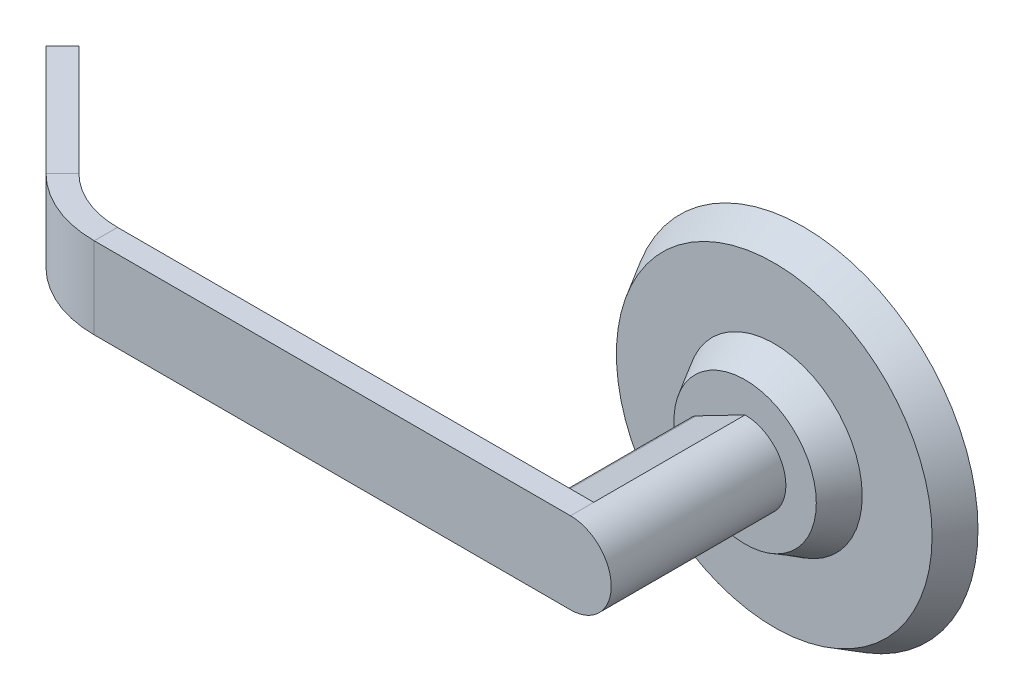
ISO-10303-21;
HEADER;
FILE_DESCRIPTION(('STEP AP214'),'2;1');
FILE_NAME('part.step','',(''),(''),'','','');
FILE_SCHEMA(('AUTOMOTIVE_DESIGN { 1 0 10303 214 1 1 1 1 }'));
ENDSEC;
DATA;
#1=APPLICATION_CONTEXT('core data for automotive mechanical design processes');
#2=APPLICATION_PROTOCOL_DEFINITION('international standard','automotive_design',2000,#1);
#3=PRODUCT_CONTEXT('',#1,'mechanical');
#4=PRODUCT('Part','Part','',(#3));
#5=PRODUCT_RELATED_PRODUCT_CATEGORY('part','',(#4));
#6=PRODUCT_DEFINITION_FORMATION('','',#4);
#7=PRODUCT_DEFINITION_CONTEXT('part definition',#1,'design');
#8=PRODUCT_DEFINITION('design','',#6,#7);
#9=PRODUCT_DEFINITION_SHAPE('','',#8);
#10=(LENGTH_UNIT() NAMED_UNIT(*) SI_UNIT(.MILLI.,.METRE.));
#11=(NAMED_UNIT(*) PLANE_ANGLE_UNIT() SI_UNIT($,.RADIAN.));
#12=(NAMED_UNIT(*) SI_UNIT($,.STERADIAN.) SOLID_ANGLE_UNIT());
#13=UNCERTAINTY_MEASURE_WITH_UNIT(LENGTH_MEASURE(1.E-05),#10,'distance_accuracy_value','');
#14=(GEOMETRIC_REPRESENTATION_CONTEXT(3) GLOBAL_UNCERTAINTY_ASSIGNED_CONTEXT((#13)) GLOBAL_UNIT_ASSIGNED_CONTEXT((#10,
#11,#12)) REPRESENTATION_CONTEXT('',''));
#15=CARTESIAN_POINT('',(0.,0.,0.));
#16=DIRECTION('',(0.,0.,1.));
#17=DIRECTION('',(1.,0.,0.));
#18=AXIS2_PLACEMENT_3D('',#15,#16,#17);
#19=CARTESIAN_POINT('',(0.,0.,-50.8));
#20=DIRECTION('',(0.,0.,-1.));
#21=DIRECTION('',(-1.,0.,0.));
#22=AXIS2_PLACEMENT_3D('',#19,#20,#21);
#23=PLANE('',#22);
#24=CARTESIAN_POINT('',(0.,0.,-50.8));
#25=DIRECTION('',(0.,0.,1.));
#26=DIRECTION('',(1.,0.,0.));
#27=AXIS2_PLACEMENT_3D('',#24,#25,#26);
#28=CIRCLE('',#27,38.1);
#29=CARTESIAN_POINT('',(38.1,0.,-50.8));
#30=VERTEX_POINT('',#29);
#31=EDGE_CURVE('E11',#30,#30,#28,.T.);
#32=ORIENTED_EDGE('',*,*,#31,.F.);
#33=EDGE_LOOP('',(#32));
#34=FACE_BOUND('',#33,.T.);
#35=ADVANCED_FACE('F39',(#34),#23,.T.);
#36=CARTESIAN_POINT('',(0.,0.,-44.45));
#37=DIRECTION('',(0.,0.,-1.));
#38=DIRECTION('',(-1.,0.,0.));
#39=AXIS2_PLACEMENT_3D('',#36,#37,#38);
#40=CONICAL_SURFACE('',#39,34.4338257906459,0.523598775598297);
#41=ORIENTED_EDGE('',*,*,#31,.T.);
#42=EDGE_LOOP('',(#41));
#43=FACE_BOUND('',#42,.T.);
#44=CARTESIAN_POINT('',(0.,0.,-44.45));
#45=DIRECTION('',(0.,0.,1.));
#46=DIRECTION('',(1.,0.,0.));
#47=AXIS2_PLACEMENT_3D('',#44,#45,#46);
#48=CIRCLE('',#47,34.4338257906459);
#49=CARTESIAN_POINT('',(34.4338257906459,0.,-44.45));
#50=VERTEX_POINT('',#49);
#51=EDGE_CURVE('E47',#50,#50,#48,.T.);
#52=ORIENTED_EDGE('',*,*,#51,.F.);
#53=EDGE_LOOP('',(#52));
#54=FACE_BOUND('',#53,.T.);
#55=ADVANCED_FACE('F285',(#43,#54),#40,.T.);
#56=CARTESIAN_POINT('',(34.4338257906459,0.,-44.45));
#57=DIRECTION('',(0.,0.,1.));
#58=DIRECTION('',(1.,0.,0.));
#59=AXIS2_PLACEMENT_3D('',#56,#57,#58);
#60=PLANE('',#59);
#61=ORIENTED_EDGE('',*,*,#51,.T.);
#62=EDGE_LOOP('',(#61));
#63=FACE_BOUND('',#62,.T.);
#64=CARTESIAN_POINT('',(0.,0.,-44.45));
#65=DIRECTION('',(0.,0.,1.));
#66=DIRECTION('',(1.,0.,0.));
#67=AXIS2_PLACEMENT_3D('',#64,#65,#66);
#68=CIRCLE('',#67,19.1938257906459);
#69=CARTESIAN_POINT('',(19.1938257906459,0.,-44.45));
#70=VERTEX_POINT('',#69);
#71=EDGE_CURVE('E275',#70,#70,#68,.T.);
#72=ORIENTED_EDGE('',*,*,#71,.F.);
#73=EDGE_LOOP('',(#72));
#74=FACE_BOUND('',#73,.T.);
#75=ADVANCED_FACE('F282',(#63,#74),#60,.T.);
#76=CARTESIAN_POINT('',(0.,0.,-38.1));
#77=DIRECTION('',(0.,0.,-1.));
#78=DIRECTION('',(-1.,0.,0.));
#79=AXIS2_PLACEMENT_3D('',#76,#77,#78);
#80=CONICAL_SURFACE('',#79,15.5276515812918,0.523598775598296);
#81=ORIENTED_EDGE('',*,*,#71,.T.);
#82=EDGE_LOOP('',(#81));
#83=FACE_BOUND('',#82,.T.);
#84=CARTESIAN_POINT('',(0.,0.,-38.1));
#85=DIRECTION('',(0.,0.,1.));
#86=DIRECTION('',(1.,0.,0.));
#87=AXIS2_PLACEMENT_3D('',#84,#85,#86);
#88=CIRCLE('',#87,15.5276515812918);
#89=CARTESIAN_POINT('',(15.5276515812918,0.,-38.1));
#90=VERTEX_POINT('',#89);
#91=EDGE_CURVE('E271',#90,#90,#88,.T.);
#92=ORIENTED_EDGE('',*,*,#91,.F.);
#93=EDGE_LOOP('',(#92));
#94=FACE_BOUND('',#93,.T.);
#95=ADVANCED_FACE('F292',(#83,#94),#80,.T.);
#96=CARTESIAN_POINT('',(15.5276515812918,0.,-38.1));
#97=DIRECTION('',(0.,0.,1.));
#98=DIRECTION('',(1.,0.,0.));
#99=AXIS2_PLACEMENT_3D('',#96,#97,#98);
#100=PLANE('',#99);
#101=CARTESIAN_POINT('',(0.,0.,-38.1));
#102=DIRECTION('',(0.,0.,1.));
#103=DIRECTION('',(-1.,0.,0.));
#104=AXIS2_PLACEMENT_3D('',#101,#102,#103);
#105=CIRCLE('',#104,8.89);
#106=CARTESIAN_POINT('',(0.,-8.89,-38.1));
#107=VERTEX_POINT('',#106);
#108=CARTESIAN_POINT('',(0.,8.89,-38.1));
#109=VERTEX_POINT('',#108);
#110=EDGE_CURVE('E241',#107,#109,#105,.T.);
#111=ORIENTED_EDGE('',*,*,#110,.F.);
#112=DIRECTION('',(0.888141509432614,-0.459570080861186,0.));
#113=VECTOR('',#112,1.);
#114=CARTESIAN_POINT('',(-10.6409620080811,-3.38381915093826,-38.1));
#115=LINE('',#114,#113);
#116=CARTESIAN_POINT('',(-10.6409620080811,-3.38381915093826,-38.1));
#117=VERTEX_POINT('',#116);
#118=EDGE_CURVE('E245',#117,#107,#115,.T.);
#119=ORIENTED_EDGE('',*,*,#118,.F.);
#120=CARTESIAN_POINT('',(-8.89,0.,-38.1));
#121=DIRECTION('',(0.,0.,1.));
#122=DIRECTION('',(1.,0.,0.));
#123=AXIS2_PLACEMENT_3D('',#120,#121,#122);
#124=CIRCLE('',#123,3.81);
#125=CARTESIAN_POINT('',(-10.6409620080811,3.38381915093826,-38.1));
#126=VERTEX_POINT('',#125);
#127=EDGE_CURVE('E252',#126,#117,#124,.T.);
#128=ORIENTED_EDGE('',*,*,#127,.F.);
#129=DIRECTION('',(-0.888141509432614,-0.459570080861186,0.));
#130=VECTOR('',#129,1.);
#131=CARTESIAN_POINT('',(0.,8.89,-38.1));
#132=LINE('',#131,#130);
#133=EDGE_CURVE('E248',#109,#126,#132,.T.);
#134=ORIENTED_EDGE('',*,*,#133,.F.);
#135=EDGE_LOOP('',(#111,#119,#128,#134));
#136=FACE_BOUND('',#135,.T.);
#137=ORIENTED_EDGE('',*,*,#91,.T.);
#138=EDGE_LOOP('',(#137));
#139=FACE_BOUND('',#138,.T.);
#140=ADVANCED_FACE('F298',(#136,#139),#100,.T.);
#141=CARTESIAN_POINT('',(0.,0.,0.));
#142=DIRECTION('',(0.,0.,-1.));
#143=DIRECTION('',(-1.,0.,0.));
#144=AXIS2_PLACEMENT_3D('',#141,#142,#143);
#145=CYLINDRICAL_SURFACE('',#144,8.89);
#146=ORIENTED_EDGE('',*,*,#110,.T.);
#147=DIRECTION('',(0.,0.,-1.));
#148=VECTOR('',#147,1.);
#149=CARTESIAN_POINT('',(0.,8.89,0.));
#150=LINE('',#149,#148);
#151=CARTESIAN_POINT('',(0.,8.89,-5.08));
#152=VERTEX_POINT('',#151);
#153=EDGE_CURVE('E266',#152,#109,#150,.T.);
#154=ORIENTED_EDGE('',*,*,#153,.F.);
#155=CARTESIAN_POINT('',(0.,8.89,0.));
#156=VERTEX_POINT('',#155);
#157=EDGE_CURVE('E267',#156,#152,#150,.T.);
#158=ORIENTED_EDGE('',*,*,#157,.F.);
#159=CARTESIAN_POINT('',(0.,0.,0.));
#160=DIRECTION('',(0.,0.,1.));
#161=DIRECTION('',(-1.,0.,0.));
#162=AXIS2_PLACEMENT_3D('',#159,#160,#161);
#163=CIRCLE('',#162,8.89);
#164=CARTESIAN_POINT('',(0.,-8.89,0.));
#165=VERTEX_POINT('',#164);
#166=EDGE_CURVE('E242',#165,#156,#163,.T.);
#167=ORIENTED_EDGE('',*,*,#166,.F.);
#168=DIRECTION('',(0.,0.,-1.));
#169=VECTOR('',#168,1.);
#170=CARTESIAN_POINT('',(0.,-8.89,0.));
#171=LINE('',#170,#169);
#172=CARTESIAN_POINT('',(0.,-8.89,-5.08));
#173=VERTEX_POINT('',#172);
#174=EDGE_CURVE('E258',#165,#173,#171,.T.);
#175=ORIENTED_EDGE('',*,*,#174,.T.);
#176=EDGE_CURVE('E54',#173,#107,#171,.T.);
#177=ORIENTED_EDGE('',*,*,#176,.T.);
#178=EDGE_LOOP('',(#146,#154,#158,#167,#175,#177));
#179=FACE_BOUND('',#178,.T.);
#180=ADVANCED_FACE('F302',(#179),#145,.T.);
#181=CARTESIAN_POINT('',(0.,8.89,0.));
#182=DIRECTION('',(0.459570080861186,-0.888141509432615,0.));
#183=DIRECTION('',(0.888141509432615,0.459570080861186,0.));
#184=AXIS2_PLACEMENT_3D('',#181,#182,#183);
#185=PLANE('',#184);
#186=DIRECTION('',(0.,0.,-1.));
#187=VECTOR('',#186,1.);
#188=CARTESIAN_POINT('',(-10.6409620080811,3.38381915093826,0.));
#189=LINE('',#188,#187);
#190=CARTESIAN_POINT('',(-10.6409620080811,3.38381915093826,-5.08));
#191=VERTEX_POINT('',#190);
#192=EDGE_CURVE('E263',#191,#126,#189,.T.);
#193=ORIENTED_EDGE('',*,*,#192,.F.);
#194=DIRECTION('',(-0.888141509432614,-0.459570080861187,0.));
#195=VECTOR('',#194,1.);
#196=CARTESIAN_POINT('',(-10.6409620080811,3.38381915093826,-5.08));
#197=LINE('',#196,#195);
#198=EDGE_CURVE('E233',#152,#191,#197,.T.);
#199=ORIENTED_EDGE('',*,*,#198,.F.);
#200=ORIENTED_EDGE('',*,*,#153,.T.);
#201=ORIENTED_EDGE('',*,*,#133,.T.);
#202=EDGE_LOOP('',(#193,#199,#200,#201));
#203=FACE_BOUND('',#202,.T.);
#204=ADVANCED_FACE('F306',(#203),#185,.F.);
#205=CARTESIAN_POINT('',(-8.89,0.,0.));
#206=DIRECTION('',(0.,0.,-1.));
#207=DIRECTION('',(-1.,0.,0.));
#208=AXIS2_PLACEMENT_3D('',#205,#206,#207);
#209=CYLINDRICAL_SURFACE('',#208,3.81);
#210=DIRECTION('',(0.,0.,-1.));
#211=VECTOR('',#210,1.);
#212=CARTESIAN_POINT('',(-10.6409620080811,-3.38381915093826,0.));
#213=LINE('',#212,#211);
#214=CARTESIAN_POINT('',(-10.6409620080811,-3.38381915093826,-5.08));
#215=VERTEX_POINT('',#214);
#216=EDGE_CURVE('E62',#215,#117,#213,.T.);
#217=ORIENTED_EDGE('',*,*,#216,.F.);
#218=CARTESIAN_POINT('',(-8.89,0.,-5.08));
#219=DIRECTION('',(0.,0.,1.));
#220=DIRECTION('',(-1.,0.,0.));
#221=AXIS2_PLACEMENT_3D('',#218,#219,#220);
#222=CIRCLE('',#221,3.81);
#223=EDGE_CURVE('E236',#191,#215,#222,.T.);
#224=ORIENTED_EDGE('',*,*,#223,.F.);
#225=ORIENTED_EDGE('',*,*,#192,.T.);
#226=ORIENTED_EDGE('',*,*,#127,.T.);
#227=EDGE_LOOP('',(#217,#224,#225,#226));
#228=FACE_BOUND('',#227,.T.);
#229=ADVANCED_FACE('F309',(#228),#209,.T.);
#230=CARTESIAN_POINT('',(-10.6409620080811,-3.38381915093826,0.));
#231=DIRECTION('',(0.459570080861186,0.888141509432615,0.));
#232=DIRECTION('',(-0.888141509432615,0.459570080861186,0.));
#233=AXIS2_PLACEMENT_3D('',#230,#231,#232);
#234=PLANE('',#233);
#235=ORIENTED_EDGE('',*,*,#176,.F.);
#236=DIRECTION('',(0.888141509432614,-0.459570080861186,0.));
#237=VECTOR('',#236,1.);
#238=CARTESIAN_POINT('',(0.,-8.89,-5.08));
#239=LINE('',#238,#237);
#240=EDGE_CURVE('E163',#215,#173,#239,.T.);
#241=ORIENTED_EDGE('',*,*,#240,.F.);
#242=ORIENTED_EDGE('',*,*,#216,.T.);
#243=ORIENTED_EDGE('',*,*,#118,.T.);
#244=EDGE_LOOP('',(#235,#241,#242,#243));
#245=FACE_BOUND('',#244,.T.);
#246=ADVANCED_FACE('F313',(#245),#234,.F.);
#247=CARTESIAN_POINT('',(0.,0.,0.));
#248=DIRECTION('',(0.,0.,-1.));
#249=DIRECTION('',(-1.,0.,0.));
#250=AXIS2_PLACEMENT_3D('',#247,#248,#249);
#251=PLANE('',#250);
#252=ORIENTED_EDGE('',*,*,#166,.T.);
#253=DIRECTION('',(-1.,0.,0.));
#254=VECTOR('',#253,1.);
#255=CARTESIAN_POINT('',(0.,8.89,0.));
#256=LINE('',#255,#254);
#257=CARTESIAN_POINT('',(-103.886,8.89,0.));
#258=VERTEX_POINT('',#257);
#259=EDGE_CURVE('E191',#156,#258,#256,.T.);
#260=ORIENTED_EDGE('',*,*,#259,.T.);
#261=DIRECTION('',(0.,1.,0.));
#262=VECTOR('',#261,1.);
#263=CARTESIAN_POINT('',(-103.886,-8.89,0.));
#264=LINE('',#263,#262);
#265=CARTESIAN_POINT('',(-103.886,-8.89,0.));
#266=VERTEX_POINT('',#265);
#267=EDGE_CURVE('E187',#266,#258,#264,.T.);
#268=ORIENTED_EDGE('',*,*,#267,.F.);
#269=DIRECTION('',(-1.,0.,0.));
#270=VECTOR('',#269,1.);
#271=CARTESIAN_POINT('',(0.,-8.89,0.));
#272=LINE('',#271,#270);
#273=EDGE_CURVE('E156',#165,#266,#272,.T.);
#274=ORIENTED_EDGE('',*,*,#273,.F.);
#275=EDGE_LOOP('',(#252,#260,#268,#274));
#276=FACE_BOUND('',#275,.T.);
#277=ADVANCED_FACE('F317',(#276),#251,.F.);
#278=CARTESIAN_POINT('',(0.,8.89,-5.08));
#279=DIRECTION('',(0.,0.,-1.));
#280=DIRECTION('',(-1.,0.,0.));
#281=AXIS2_PLACEMENT_3D('',#278,#279,#280);
#282=PLANE('',#281);
#283=ORIENTED_EDGE('',*,*,#198,.T.);
#284=ORIENTED_EDGE('',*,*,#223,.T.);
#285=ORIENTED_EDGE('',*,*,#240,.T.);
#286=DIRECTION('',(-1.,0.,0.));
#287=VECTOR('',#286,1.);
#288=CARTESIAN_POINT('',(0.,-8.89,-5.08));
#289=LINE('',#288,#287);
#290=CARTESIAN_POINT('',(-103.886,-8.89,-5.07999999999999));
#291=VERTEX_POINT('',#290);
#292=EDGE_CURVE('E154',#173,#291,#289,.T.);
#293=ORIENTED_EDGE('',*,*,#292,.T.);
#294=DIRECTION('',(0.,-1.,0.));
#295=VECTOR('',#294,1.);
#296=CARTESIAN_POINT('',(-103.886,8.89,-5.07999999999999));
#297=LINE('',#296,#295);
#298=CARTESIAN_POINT('',(-103.886,8.89,-5.07999999999999));
#299=VERTEX_POINT('',#298);
#300=EDGE_CURVE('E136',#299,#291,#297,.T.);
#301=ORIENTED_EDGE('',*,*,#300,.F.);
#302=DIRECTION('',(-1.,0.,0.));
#303=VECTOR('',#302,1.);
#304=CARTESIAN_POINT('',(0.,8.89,-5.08));
#305=LINE('',#304,#303);
#306=EDGE_CURVE('E147',#152,#299,#305,.T.);
#307=ORIENTED_EDGE('',*,*,#306,.F.);
#308=EDGE_LOOP('',(#283,#284,#285,#293,#301,#307));
#309=FACE_BOUND('',#308,.T.);
#310=ADVANCED_FACE('F161',(#309),#282,.T.);
#311=CARTESIAN_POINT('',(-145.913598646604,0.,-31.5065741623271));
#312=DIRECTION('',(-0.707106781186546,0.,-0.707106781186549));
#313=DIRECTION('',(0.,-1.,0.));
#314=AXIS2_PLACEMENT_3D('',#311,#312,#313);
#315=PLANE('',#314);
#316=DIRECTION('',(-0.707106781186549,0.,0.707106781186546));
#317=VECTOR('',#316,1.);
#318=CARTESIAN_POINT('',(-142.321496198176,-8.89,-35.0986766107547));
#319=LINE('',#318,#317);
#320=CARTESIAN_POINT('',(-142.321496198176,-8.89,-35.0986766107547));
#321=VERTEX_POINT('',#320);
#322=CARTESIAN_POINT('',(-145.913598646604,-8.89,-31.5065741623271));
#323=VERTEX_POINT('',#322);
#324=EDGE_CURVE('E174',#321,#323,#319,.T.);
#325=ORIENTED_EDGE('',*,*,#324,.T.);
#326=DIRECTION('',(0.,1.,0.));
#327=VECTOR('',#326,1.);
#328=CARTESIAN_POINT('',(-145.913598646604,-8.89,-31.5065741623271));
#329=LINE('',#328,#327);
#330=CARTESIAN_POINT('',(-145.913598646604,8.89,-31.5065741623271));
#331=VERTEX_POINT('',#330);
#332=EDGE_CURVE('E182',#323,#331,#329,.T.);
#333=ORIENTED_EDGE('',*,*,#332,.T.);
#334=DIRECTION('',(0.707106781186549,0.,-0.707106781186546));
#335=VECTOR('',#334,1.);
#336=CARTESIAN_POINT('',(-145.913598646604,8.89,-31.5065741623271));
#337=LINE('',#336,#335);
#338=CARTESIAN_POINT('',(-142.321496198176,8.89,-35.0986766107548));
#339=VERTEX_POINT('',#338);
#340=EDGE_CURVE('E210',#331,#339,#337,.T.);
#341=ORIENTED_EDGE('',*,*,#340,.T.);
#342=DIRECTION('',(0.,-1.,0.));
#343=VECTOR('',#342,1.);
#344=CARTESIAN_POINT('',(-142.321496198176,8.89,-35.0986766107548));
#345=LINE('',#344,#343);
#346=EDGE_CURVE('E226',#339,#321,#345,.T.);
#347=ORIENTED_EDGE('',*,*,#346,.T.);
#348=EDGE_LOOP('',(#325,#333,#341,#347));
#349=FACE_BOUND('',#348,.T.);
#350=ADVANCED_FACE('F321',(#349),#315,.T.);
#351=CARTESIAN_POINT('',(0.,-8.89,-5.08));
#352=DIRECTION('',(0.,-1.,0.));
#353=DIRECTION('',(0.,0.,-1.));
#354=AXIS2_PLACEMENT_3D('',#351,#352,#353);
#355=PLANE('',#354);
#356=ORIENTED_EDGE('',*,*,#273,.T.);
#357=DIRECTION('',(0.,0.,1.));
#358=VECTOR('',#357,1.);
#359=CARTESIAN_POINT('',(-103.886,-8.89,-5.07999999999999));
#360=LINE('',#359,#358);
#361=EDGE_CURVE('E130',#291,#266,#360,.T.);
#362=ORIENTED_EDGE('',*,*,#361,.F.);
#363=ORIENTED_EDGE('',*,*,#292,.F.);
#364=ORIENTED_EDGE('',*,*,#174,.F.);
#365=EDGE_LOOP('',(#356,#362,#363,#364));
#366=FACE_BOUND('',#365,.T.);
#367=ADVANCED_FACE('F152',(#366),#355,.T.);
#368=CARTESIAN_POINT('',(0.,8.89,0.));
#369=DIRECTION('',(0.,1.,0.));
#370=DIRECTION('',(0.,0.,1.));
#371=AXIS2_PLACEMENT_3D('',#368,#369,#370);
#372=PLANE('',#371);
#373=ORIENTED_EDGE('',*,*,#306,.T.);
#374=DIRECTION('',(0.,0.,-1.));
#375=VECTOR('',#374,1.);
#376=CARTESIAN_POINT('',(-103.886,8.89,0.));
#377=LINE('',#376,#375);
#378=EDGE_CURVE('E195',#258,#299,#377,.T.);
#379=ORIENTED_EDGE('',*,*,#378,.F.);
#380=ORIENTED_EDGE('',*,*,#259,.F.);
#381=ORIENTED_EDGE('',*,*,#157,.T.);
#382=EDGE_LOOP('',(#373,#379,#380,#381));
#383=FACE_BOUND('',#382,.T.);
#384=ADVANCED_FACE('F344',(#383),#372,.T.);
#385=CARTESIAN_POINT('',(-103.886,-8.89,-5.07999999999998));
#386=DIRECTION('',(0.,-1.,0.));
#387=DIRECTION('',(0.,0.,-1.));
#388=AXIS2_PLACEMENT_3D('',#385,#386,#387);
#389=PLANE('',#388);
#390=CARTESIAN_POINT('',(-103.886,-8.89,-25.4));
#391=DIRECTION('',(0.,-1.,0.));
#392=DIRECTION('',(0.,0.,1.));
#393=AXIS2_PLACEMENT_3D('',#390,#391,#392);
#394=CIRCLE('',#393,25.4);
#395=CARTESIAN_POINT('',(-121.846512242138,-8.89,-7.43948775786169));
#396=VERTEX_POINT('',#395);
#397=EDGE_CURVE('E170',#266,#396,#394,.T.);
#398=ORIENTED_EDGE('',*,*,#397,.T.);
#399=DIRECTION('',(-0.707106781186549,0.,0.707106781186546));
#400=VECTOR('',#399,1.);
#401=CARTESIAN_POINT('',(-118.254409793711,-8.89,-11.0315902062893));
#402=LINE('',#401,#400);
#403=CARTESIAN_POINT('',(-118.254409793711,-8.89,-11.0315902062894));
#404=VERTEX_POINT('',#403);
#405=EDGE_CURVE('E132',#404,#396,#402,.T.);
#406=ORIENTED_EDGE('',*,*,#405,.F.);
#407=CARTESIAN_POINT('',(-103.886,-8.89,-25.4));
#408=DIRECTION('',(0.,-1.,0.));
#409=DIRECTION('',(0.,0.,1.));
#410=AXIS2_PLACEMENT_3D('',#407,#408,#409);
#411=CIRCLE('',#410,20.32);
#412=EDGE_CURVE('E125',#291,#404,#411,.T.);
#413=ORIENTED_EDGE('',*,*,#412,.F.);
#414=ORIENTED_EDGE('',*,*,#361,.T.);
#415=EDGE_LOOP('',(#398,#406,#413,#414));
#416=FACE_BOUND('',#415,.T.);
#417=ADVANCED_FACE('F128',(#416),#389,.T.);
#418=CARTESIAN_POINT('',(-103.886,0.,-25.4));
#419=DIRECTION('',(0.,-1.,0.));
#420=DIRECTION('',(0.,0.,-1.));
#421=AXIS2_PLACEMENT_3D('',#418,#419,#420);
#422=CYLINDRICAL_SURFACE('',#421,25.4);
#423=CARTESIAN_POINT('',(-103.886,8.89,-25.4));
#424=DIRECTION('',(0.,-1.,0.));
#425=DIRECTION('',(0.,0.,1.));
#426=AXIS2_PLACEMENT_3D('',#423,#424,#425);
#427=CIRCLE('',#426,25.4);
#428=CARTESIAN_POINT('',(-121.846512242138,8.89,-7.43948775786171));
#429=VERTEX_POINT('',#428);
#430=EDGE_CURVE('E199',#258,#429,#427,.T.);
#431=ORIENTED_EDGE('',*,*,#430,.T.);
#432=DIRECTION('',(0.,1.,0.));
#433=VECTOR('',#432,1.);
#434=CARTESIAN_POINT('',(-121.846512242138,-8.89,-7.43948775786169));
#435=LINE('',#434,#433);
#436=EDGE_CURVE('E172',#396,#429,#435,.T.);
#437=ORIENTED_EDGE('',*,*,#436,.F.);
#438=ORIENTED_EDGE('',*,*,#397,.F.);
#439=ORIENTED_EDGE('',*,*,#267,.T.);
#440=EDGE_LOOP('',(#431,#437,#438,#439));
#441=FACE_BOUND('',#440,.T.);
#442=ADVANCED_FACE('F342',(#441),#422,.T.);
#443=CARTESIAN_POINT('',(-103.886,8.89,0.));
#444=DIRECTION('',(0.,1.,0.));
#445=DIRECTION('',(0.,0.,1.));
#446=AXIS2_PLACEMENT_3D('',#443,#444,#445);
#447=PLANE('',#446);
#448=CARTESIAN_POINT('',(-103.886,8.89,-25.4));
#449=DIRECTION('',(0.,-1.,0.));
#450=DIRECTION('',(0.,0.,1.));
#451=AXIS2_PLACEMENT_3D('',#448,#449,#450);
#452=CIRCLE('',#451,20.32);
#453=CARTESIAN_POINT('',(-118.254409793711,8.89,-11.0315902062894));
#454=VERTEX_POINT('',#453);
#455=EDGE_CURVE('E141',#299,#454,#452,.T.);
#456=ORIENTED_EDGE('',*,*,#455,.T.);
#457=DIRECTION('',(0.707106781186549,0.,-0.707106781186546));
#458=VECTOR('',#457,1.);
#459=CARTESIAN_POINT('',(-121.846512242138,8.89,-7.43948775786171));
#460=LINE('',#459,#458);
#461=EDGE_CURVE('E203',#429,#454,#460,.T.);
#462=ORIENTED_EDGE('',*,*,#461,.F.);
#463=ORIENTED_EDGE('',*,*,#430,.F.);
#464=ORIENTED_EDGE('',*,*,#378,.T.);
#465=EDGE_LOOP('',(#456,#462,#463,#464));
#466=FACE_BOUND('',#465,.T.);
#467=ADVANCED_FACE('F333',(#466),#447,.T.);
#468=CARTESIAN_POINT('',(-103.886,0.,-25.4));
#469=DIRECTION('',(0.,-1.,0.));
#470=DIRECTION('',(0.,0.,-1.));
#471=AXIS2_PLACEMENT_3D('',#468,#469,#470);
#472=CYLINDRICAL_SURFACE('',#471,20.32);
#473=DIRECTION('',(0.,-1.,0.));
#474=VECTOR('',#473,1.);
#475=CARTESIAN_POINT('',(-118.254409793711,8.89,-11.0315902062894));
#476=LINE('',#475,#474);
#477=EDGE_CURVE('E186',#454,#404,#476,.T.);
#478=ORIENTED_EDGE('',*,*,#477,.F.);
#479=ORIENTED_EDGE('',*,*,#455,.F.);
#480=ORIENTED_EDGE('',*,*,#300,.T.);
#481=ORIENTED_EDGE('',*,*,#412,.T.);
#482=EDGE_LOOP('',(#478,#479,#480,#481));
#483=FACE_BOUND('',#482,.T.);
#484=ADVANCED_FACE('F139',(#483),#472,.F.);
#485=CARTESIAN_POINT('',(-118.254409793711,-8.89,-11.0315902062893));
#486=DIRECTION('',(0.,-1.,0.));
#487=DIRECTION('',(0.,0.,-1.));
#488=AXIS2_PLACEMENT_3D('',#485,#486,#487);
#489=PLANE('',#488);
#490=DIRECTION('',(-0.707106781186546,0.,-0.707106781186549));
#491=VECTOR('',#490,1.);
#492=CARTESIAN_POINT('',(-121.846512242138,-8.89,-7.43948775786168));
#493=LINE('',#492,#491);
#494=EDGE_CURVE('E177',#396,#323,#493,.T.);
#495=ORIENTED_EDGE('',*,*,#494,.T.);
#496=ORIENTED_EDGE('',*,*,#324,.F.);
#497=DIRECTION('',(-0.707106781186546,0.,-0.707106781186549));
#498=VECTOR('',#497,1.);
#499=CARTESIAN_POINT('',(-118.254409793711,-8.89,-11.0315902062893));
#500=LINE('',#499,#498);
#501=EDGE_CURVE('E178',#404,#321,#500,.T.);
#502=ORIENTED_EDGE('',*,*,#501,.F.);
#503=ORIENTED_EDGE('',*,*,#405,.T.);
#504=EDGE_LOOP('',(#495,#496,#502,#503));
#505=FACE_BOUND('',#504,.T.);
#506=ADVANCED_FACE('F332',(#505),#489,.T.);
#507=CARTESIAN_POINT('',(-121.846512242138,-8.89,-7.43948775786168));
#508=DIRECTION('',(-0.707106781186549,0.,0.707106781186546));
#509=DIRECTION('',(0.707106781186546,0.,0.707106781186549));
#510=AXIS2_PLACEMENT_3D('',#507,#508,#509);
#511=PLANE('',#510);
#512=DIRECTION('',(-0.707106781186546,0.,-0.707106781186549));
#513=VECTOR('',#512,1.);
#514=CARTESIAN_POINT('',(-121.846512242138,8.89,-7.43948775786171));
#515=LINE('',#514,#513);
#516=EDGE_CURVE('E206',#429,#331,#515,.T.);
#517=ORIENTED_EDGE('',*,*,#516,.T.);
#518=ORIENTED_EDGE('',*,*,#332,.F.);
#519=ORIENTED_EDGE('',*,*,#494,.F.);
#520=ORIENTED_EDGE('',*,*,#436,.T.);
#521=EDGE_LOOP('',(#517,#518,#519,#520));
#522=FACE_BOUND('',#521,.T.);
#523=ADVANCED_FACE('F338',(#522),#511,.T.);
#524=CARTESIAN_POINT('',(-121.846512242138,8.89,-7.43948775786171));
#525=DIRECTION('',(0.,1.,0.));
#526=DIRECTION('',(0.,0.,1.));
#527=AXIS2_PLACEMENT_3D('',#524,#525,#526);
#528=PLANE('',#527);
#529=DIRECTION('',(-0.707106781186546,0.,-0.707106781186549));
#530=VECTOR('',#529,1.);
#531=CARTESIAN_POINT('',(-118.254409793711,8.89,-11.0315902062894));
#532=LINE('',#531,#530);
#533=EDGE_CURVE('E223',#454,#339,#532,.T.);
#534=ORIENTED_EDGE('',*,*,#533,.T.);
#535=ORIENTED_EDGE('',*,*,#340,.F.);
#536=ORIENTED_EDGE('',*,*,#516,.F.);
#537=ORIENTED_EDGE('',*,*,#461,.T.);
#538=EDGE_LOOP('',(#534,#535,#536,#537));
#539=FACE_BOUND('',#538,.T.);
#540=ADVANCED_FACE('F328',(#539),#528,.T.);
#541=CARTESIAN_POINT('',(-118.254409793711,8.89,-11.0315902062894));
#542=DIRECTION('',(0.707106781186549,0.,-0.707106781186546));
#543=DIRECTION('',(-0.707106781186546,0.,-0.707106781186549));
#544=AXIS2_PLACEMENT_3D('',#541,#542,#543);
#545=PLANE('',#544);
#546=ORIENTED_EDGE('',*,*,#346,.F.);
#547=ORIENTED_EDGE('',*,*,#533,.F.);
#548=ORIENTED_EDGE('',*,*,#477,.T.);
#549=ORIENTED_EDGE('',*,*,#501,.T.);
#550=EDGE_LOOP('',(#546,#547,#548,#549));
#551=FACE_BOUND('',#550,.T.);
#552=ADVANCED_FACE('F325',(#551),#545,.T.);
#553=CLOSED_SHELL('',(#35,#55,#75,#95,#140,#180,#204,#229,#246,#277,#310,#350,#367,#384,#417,
#442,#467,#484,#506,#523,#540,#552));
#554=MANIFOLD_SOLID_BREP('B2',#553);
#555=ADVANCED_BREP_SHAPE_REPRESENTATION('',(#18,#554),#14);
#556=SHAPE_DEFINITION_REPRESENTATION(#9,#555);
ENDSEC;
END-ISO-10303-21;
